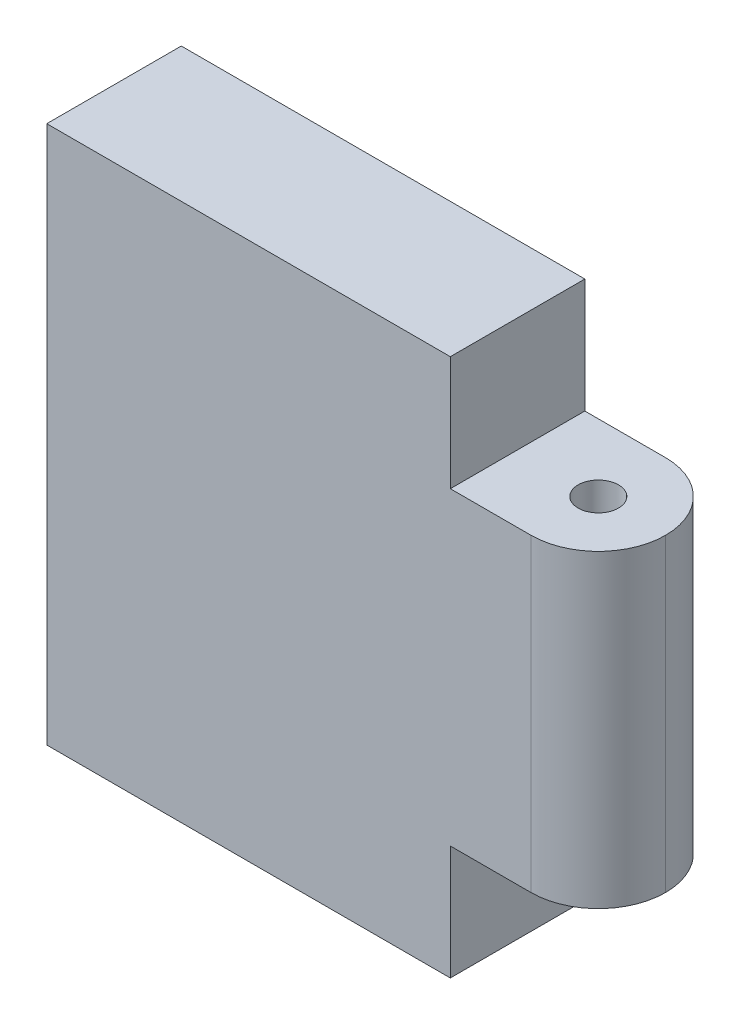
ISO-10303-21;
HEADER;
FILE_DESCRIPTION(('STEP AP214'),'2;1');
FILE_NAME('part.step','',(''),(''),'','','');
FILE_SCHEMA(('AUTOMOTIVE_DESIGN { 1 0 10303 214 1 1 1 1 }'));
ENDSEC;
DATA;
#1=APPLICATION_CONTEXT('core data for automotive mechanical design processes');
#2=APPLICATION_PROTOCOL_DEFINITION('international standard','automotive_design',2000,#1);
#3=PRODUCT_CONTEXT('',#1,'mechanical');
#4=PRODUCT('Part','Part','',(#3));
#5=PRODUCT_RELATED_PRODUCT_CATEGORY('part','',(#4));
#6=PRODUCT_DEFINITION_FORMATION('','',#4);
#7=PRODUCT_DEFINITION_CONTEXT('part definition',#1,'design');
#8=PRODUCT_DEFINITION('design','',#6,#7);
#9=PRODUCT_DEFINITION_SHAPE('','',#8);
#10=(LENGTH_UNIT() NAMED_UNIT(*) SI_UNIT(.MILLI.,.METRE.));
#11=(NAMED_UNIT(*) PLANE_ANGLE_UNIT() SI_UNIT($,.RADIAN.));
#12=(NAMED_UNIT(*) SI_UNIT($,.STERADIAN.) SOLID_ANGLE_UNIT());
#13=UNCERTAINTY_MEASURE_WITH_UNIT(LENGTH_MEASURE(1.E-05),#10,'distance_accuracy_value','');
#14=(GEOMETRIC_REPRESENTATION_CONTEXT(3) GLOBAL_UNCERTAINTY_ASSIGNED_CONTEXT((#13)) GLOBAL_UNIT_ASSIGNED_CONTEXT((#10,
#11,#12)) REPRESENTATION_CONTEXT('',''));
#15=CARTESIAN_POINT('',(0.,0.,0.));
#16=DIRECTION('',(0.,0.,1.));
#17=DIRECTION('',(1.,0.,0.));
#18=AXIS2_PLACEMENT_3D('',#15,#16,#17);
#19=CARTESIAN_POINT('',(0.,0.,0.));
#20=DIRECTION('',(-1.,0.,0.));
#21=DIRECTION('',(0.,-1.,0.));
#22=AXIS2_PLACEMENT_3D('',#19,#20,#21);
#23=PLANE('',#22);
#24=DIRECTION('',(0.,-1.,0.));
#25=VECTOR('',#24,1.);
#26=CARTESIAN_POINT('',(0.,0.,10.));
#27=LINE('',#26,#25);
#28=CARTESIAN_POINT('',(0.,20.,10.));
#29=VERTEX_POINT('',#28);
#30=CARTESIAN_POINT('',(0.,-20.,10.));
#31=VERTEX_POINT('',#30);
#32=EDGE_CURVE('E164',#29,#31,#27,.T.);
#33=ORIENTED_EDGE('',*,*,#32,.F.);
#34=DIRECTION('',(0.,0.,-1.));
#35=VECTOR('',#34,1.);
#36=CARTESIAN_POINT('',(0.,20.,10.));
#37=LINE('',#36,#35);
#38=CARTESIAN_POINT('',(0.,20.,0.));
#39=VERTEX_POINT('',#38);
#40=EDGE_CURVE('E130',#29,#39,#37,.T.);
#41=ORIENTED_EDGE('',*,*,#40,.T.);
#42=DIRECTION('',(0.,-1.,0.));
#43=VECTOR('',#42,1.);
#44=CARTESIAN_POINT('',(0.,0.,0.));
#45=LINE('',#44,#43);
#46=CARTESIAN_POINT('',(0.,-20.,0.));
#47=VERTEX_POINT('',#46);
#48=EDGE_CURVE('E117',#39,#47,#45,.T.);
#49=ORIENTED_EDGE('',*,*,#48,.T.);
#50=DIRECTION('',(0.,0.,1.));
#51=VECTOR('',#50,1.);
#52=CARTESIAN_POINT('',(0.,-20.,10.));
#53=LINE('',#52,#51);
#54=EDGE_CURVE('E126',#47,#31,#53,.T.);
#55=ORIENTED_EDGE('',*,*,#54,.T.);
#56=EDGE_LOOP('',(#33,#41,#49,#55));
#57=FACE_BOUND('',#56,.T.);
#58=ADVANCED_FACE('F38',(#57),#23,.T.);
#59=CARTESIAN_POINT('',(-30.,20.,10.));
#60=DIRECTION('',(0.,-1.,0.));
#61=DIRECTION('',(0.,0.,-1.));
#62=AXIS2_PLACEMENT_3D('',#59,#60,#61);
#63=PLANE('',#62);
#64=ORIENTED_EDGE('',*,*,#40,.F.);
#65=DIRECTION('',(-1.,0.,0.));
#66=VECTOR('',#65,1.);
#67=CARTESIAN_POINT('',(-30.,20.,10.));
#68=LINE('',#67,#66);
#69=CARTESIAN_POINT('',(30.,20.,10.));
#70=VERTEX_POINT('',#69);
#71=EDGE_CURVE('E138',#70,#29,#68,.T.);
#72=ORIENTED_EDGE('',*,*,#71,.F.);
#73=DIRECTION('',(0.,0.,-1.));
#74=VECTOR('',#73,1.);
#75=CARTESIAN_POINT('',(30.,20.,10.));
#76=LINE('',#75,#74);
#77=CARTESIAN_POINT('',(30.,20.,0.));
#78=VERTEX_POINT('',#77);
#79=EDGE_CURVE('E180',#70,#78,#76,.T.);
#80=ORIENTED_EDGE('',*,*,#79,.T.);
#81=DIRECTION('',(-1.,0.,0.));
#82=VECTOR('',#81,1.);
#83=CARTESIAN_POINT('',(-30.,20.,0.));
#84=LINE('',#83,#82);
#85=EDGE_CURVE('E42',#78,#39,#84,.T.);
#86=ORIENTED_EDGE('',*,*,#85,.T.);
#87=EDGE_LOOP('',(#64,#72,#80,#86));
#88=FACE_BOUND('',#87,.T.);
#89=ADVANCED_FACE('F204',(#88),#63,.F.);
#90=CARTESIAN_POINT('',(-30.,-20.,10.));
#91=DIRECTION('',(0.,1.,0.));
#92=DIRECTION('',(0.,0.,1.));
#93=AXIS2_PLACEMENT_3D('',#90,#91,#92);
#94=PLANE('',#93);
#95=ORIENTED_EDGE('',*,*,#54,.F.);
#96=DIRECTION('',(1.,0.,0.));
#97=VECTOR('',#96,1.);
#98=CARTESIAN_POINT('',(-30.,-20.,0.));
#99=LINE('',#98,#97);
#100=CARTESIAN_POINT('',(30.,-20.,0.));
#101=VERTEX_POINT('',#100);
#102=EDGE_CURVE('E112',#47,#101,#99,.T.);
#103=ORIENTED_EDGE('',*,*,#102,.T.);
#104=DIRECTION('',(0.,0.,-1.));
#105=VECTOR('',#104,1.);
#106=CARTESIAN_POINT('',(30.,-20.,10.));
#107=LINE('',#106,#105);
#108=CARTESIAN_POINT('',(30.,-20.,10.));
#109=VERTEX_POINT('',#108);
#110=EDGE_CURVE('E139',#109,#101,#107,.T.);
#111=ORIENTED_EDGE('',*,*,#110,.F.);
#112=DIRECTION('',(1.,0.,0.));
#113=VECTOR('',#112,1.);
#114=CARTESIAN_POINT('',(-30.,-20.,10.));
#115=LINE('',#114,#113);
#116=EDGE_CURVE('E128',#31,#109,#115,.T.);
#117=ORIENTED_EDGE('',*,*,#116,.F.);
#118=EDGE_LOOP('',(#95,#103,#111,#117));
#119=FACE_BOUND('',#118,.T.);
#120=ADVANCED_FACE('F127',(#119),#94,.F.);
#121=CARTESIAN_POINT('',(0.,0.,10.));
#122=DIRECTION('',(0.,0.,1.));
#123=DIRECTION('',(1.,0.,0.));
#124=AXIS2_PLACEMENT_3D('',#121,#122,#123);
#125=PLANE('',#124);
#126=ORIENTED_EDGE('',*,*,#71,.T.);
#127=ORIENTED_EDGE('',*,*,#32,.T.);
#128=ORIENTED_EDGE('',*,*,#116,.T.);
#129=DIRECTION('',(0.,1.,0.));
#130=VECTOR('',#129,1.);
#131=CARTESIAN_POINT('',(30.,20.,10.));
#132=LINE('',#131,#130);
#133=CARTESIAN_POINT('',(30.,-11.5,10.));
#134=VERTEX_POINT('',#133);
#135=EDGE_CURVE('E141',#109,#134,#132,.T.);
#136=ORIENTED_EDGE('',*,*,#135,.T.);
#137=DIRECTION('',(-1.,0.,0.));
#138=VECTOR('',#137,1.);
#139=CARTESIAN_POINT('',(41.,-11.5,10.));
#140=LINE('',#139,#138);
#141=CARTESIAN_POINT('',(36.,-11.5,10.));
#142=VERTEX_POINT('',#141);
#143=EDGE_CURVE('E63',#142,#134,#140,.T.);
#144=ORIENTED_EDGE('',*,*,#143,.F.);
#145=DIRECTION('',(0.,1.,0.));
#146=VECTOR('',#145,1.);
#147=CARTESIAN_POINT('',(36.,0.,10.));
#148=LINE('',#147,#146);
#149=CARTESIAN_POINT('',(36.,11.5,10.));
#150=VERTEX_POINT('',#149);
#151=EDGE_CURVE('E165',#142,#150,#148,.T.);
#152=ORIENTED_EDGE('',*,*,#151,.T.);
#153=DIRECTION('',(-1.,0.,0.));
#154=VECTOR('',#153,1.);
#155=CARTESIAN_POINT('',(41.,11.5,10.));
#156=LINE('',#155,#154);
#157=CARTESIAN_POINT('',(30.,11.5,10.));
#158=VERTEX_POINT('',#157);
#159=EDGE_CURVE('E55',#150,#158,#156,.T.);
#160=ORIENTED_EDGE('',*,*,#159,.T.);
#161=EDGE_CURVE('E123',#158,#70,#132,.T.);
#162=ORIENTED_EDGE('',*,*,#161,.T.);
#163=EDGE_LOOP('',(#126,#127,#128,#136,#144,#152,#160,#162));
#164=FACE_BOUND('',#163,.T.);
#165=ADVANCED_FACE('F40',(#164),#125,.T.);
#166=CARTESIAN_POINT('',(0.,0.,0.));
#167=DIRECTION('',(0.,0.,1.));
#168=DIRECTION('',(1.,0.,0.));
#169=AXIS2_PLACEMENT_3D('',#166,#167,#168);
#170=PLANE('',#169);
#171=ORIENTED_EDGE('',*,*,#48,.F.);
#172=ORIENTED_EDGE('',*,*,#85,.F.);
#173=DIRECTION('',(0.,1.,0.));
#174=VECTOR('',#173,1.);
#175=CARTESIAN_POINT('',(30.,20.,0.));
#176=LINE('',#175,#174);
#177=CARTESIAN_POINT('',(30.,11.5,0.));
#178=VERTEX_POINT('',#177);
#179=EDGE_CURVE('E151',#178,#78,#176,.T.);
#180=ORIENTED_EDGE('',*,*,#179,.F.);
#181=DIRECTION('',(-1.,0.,0.));
#182=VECTOR('',#181,1.);
#183=CARTESIAN_POINT('',(41.,11.5,0.));
#184=LINE('',#183,#182);
#185=CARTESIAN_POINT('',(36.,11.5,0.));
#186=VERTEX_POINT('',#185);
#187=EDGE_CURVE('E149',#186,#178,#184,.T.);
#188=ORIENTED_EDGE('',*,*,#187,.F.);
#189=DIRECTION('',(0.,-1.,0.));
#190=VECTOR('',#189,1.);
#191=CARTESIAN_POINT('',(36.,-11.5,0.));
#192=LINE('',#191,#190);
#193=CARTESIAN_POINT('',(36.,-11.5,0.));
#194=VERTEX_POINT('',#193);
#195=EDGE_CURVE('E177',#186,#194,#192,.T.);
#196=ORIENTED_EDGE('',*,*,#195,.T.);
#197=DIRECTION('',(-1.,0.,0.));
#198=VECTOR('',#197,1.);
#199=CARTESIAN_POINT('',(41.,-11.5,0.));
#200=LINE('',#199,#198);
#201=CARTESIAN_POINT('',(30.,-11.5,0.));
#202=VERTEX_POINT('',#201);
#203=EDGE_CURVE('E154',#194,#202,#200,.T.);
#204=ORIENTED_EDGE('',*,*,#203,.T.);
#205=EDGE_CURVE('E119',#101,#202,#176,.T.);
#206=ORIENTED_EDGE('',*,*,#205,.F.);
#207=ORIENTED_EDGE('',*,*,#102,.F.);
#208=EDGE_LOOP('',(#171,#172,#180,#188,#196,#204,#206,#207));
#209=FACE_BOUND('',#208,.T.);
#210=ADVANCED_FACE('F114',(#209),#170,.F.);
#211=CARTESIAN_POINT('',(30.,20.,10.));
#212=DIRECTION('',(-1.,0.,0.));
#213=DIRECTION('',(0.,-1.,0.));
#214=AXIS2_PLACEMENT_3D('',#211,#212,#213);
#215=PLANE('',#214);
#216=ORIENTED_EDGE('',*,*,#205,.T.);
#217=DIRECTION('',(0.,0.,1.));
#218=VECTOR('',#217,1.);
#219=CARTESIAN_POINT('',(30.,-11.5,0.));
#220=LINE('',#219,#218);
#221=EDGE_CURVE('E156',#202,#134,#220,.T.);
#222=ORIENTED_EDGE('',*,*,#221,.T.);
#223=ORIENTED_EDGE('',*,*,#135,.F.);
#224=ORIENTED_EDGE('',*,*,#110,.T.);
#225=EDGE_LOOP('',(#216,#222,#223,#224));
#226=FACE_BOUND('',#225,.T.);
#227=ADVANCED_FACE('F185',(#226),#215,.F.);
#228=ORIENTED_EDGE('',*,*,#161,.F.);
#229=DIRECTION('',(0.,0.,-1.));
#230=VECTOR('',#229,1.);
#231=CARTESIAN_POINT('',(30.,11.5,0.));
#232=LINE('',#231,#230);
#233=EDGE_CURVE('E158',#158,#178,#232,.T.);
#234=ORIENTED_EDGE('',*,*,#233,.T.);
#235=ORIENTED_EDGE('',*,*,#179,.T.);
#236=ORIENTED_EDGE('',*,*,#79,.F.);
#237=EDGE_LOOP('',(#228,#234,#235,#236));
#238=FACE_BOUND('',#237,.T.);
#239=ADVANCED_FACE('F224',(#238),#215,.F.);
#240=CARTESIAN_POINT('',(41.,11.5,0.));
#241=DIRECTION('',(0.,1.,0.));
#242=DIRECTION('',(-1.,0.,0.));
#243=AXIS2_PLACEMENT_3D('',#240,#241,#242);
#244=PLANE('',#243);
#245=CARTESIAN_POINT('',(36.,11.5,5.));
#246=DIRECTION('',(0.,-1.,0.));
#247=DIRECTION('',(1.,0.,0.));
#248=AXIS2_PLACEMENT_3D('',#245,#246,#247);
#249=CIRCLE('',#248,1.5);
#250=CARTESIAN_POINT('',(37.5,11.5,5.));
#251=VERTEX_POINT('',#250);
#252=EDGE_CURVE('E47',#251,#251,#249,.T.);
#253=ORIENTED_EDGE('',*,*,#252,.T.);
#254=EDGE_LOOP('',(#253));
#255=FACE_BOUND('',#254,.T.);
#256=CARTESIAN_POINT('',(36.,11.5,5.));
#257=DIRECTION('',(0.,1.,0.));
#258=DIRECTION('',(-1.,0.,0.));
#259=AXIS2_PLACEMENT_3D('',#256,#257,#258);
#260=CIRCLE('',#259,5.);
#261=CARTESIAN_POINT('',(41.,11.5,5.));
#262=VERTEX_POINT('',#261);
#263=EDGE_CURVE('E169',#150,#262,#260,.T.);
#264=ORIENTED_EDGE('',*,*,#263,.T.);
#265=CARTESIAN_POINT('',(36.,11.5,5.));
#266=DIRECTION('',(0.,1.,0.));
#267=DIRECTION('',(-1.,0.,0.));
#268=AXIS2_PLACEMENT_3D('',#265,#266,#267);
#269=CIRCLE('',#268,5.);
#270=EDGE_CURVE('E166',#262,#186,#269,.T.);
#271=ORIENTED_EDGE('',*,*,#270,.T.);
#272=ORIENTED_EDGE('',*,*,#187,.T.);
#273=ORIENTED_EDGE('',*,*,#233,.F.);
#274=ORIENTED_EDGE('',*,*,#159,.F.);
#275=EDGE_LOOP('',(#264,#271,#272,#273,#274));
#276=FACE_BOUND('',#275,.T.);
#277=ADVANCED_FACE('F220',(#255,#276),#244,.T.);
#278=CARTESIAN_POINT('',(41.,-11.5,0.));
#279=DIRECTION('',(0.,-1.,0.));
#280=DIRECTION('',(1.,0.,0.));
#281=AXIS2_PLACEMENT_3D('',#278,#279,#280);
#282=PLANE('',#281);
#283=CARTESIAN_POINT('',(36.,-11.5,5.));
#284=DIRECTION('',(0.,-1.,0.));
#285=DIRECTION('',(1.,0.,0.));
#286=AXIS2_PLACEMENT_3D('',#283,#284,#285);
#287=CIRCLE('',#286,1.5);
#288=CARTESIAN_POINT('',(37.5,-11.5,5.));
#289=VERTEX_POINT('',#288);
#290=EDGE_CURVE('E161',#289,#289,#287,.F.);
#291=ORIENTED_EDGE('',*,*,#290,.T.);
#292=EDGE_LOOP('',(#291));
#293=FACE_BOUND('',#292,.T.);
#294=ORIENTED_EDGE('',*,*,#203,.F.);
#295=CARTESIAN_POINT('',(36.,-11.5,5.));
#296=DIRECTION('',(0.,-1.,0.));
#297=DIRECTION('',(1.,0.,0.));
#298=AXIS2_PLACEMENT_3D('',#295,#296,#297);
#299=CIRCLE('',#298,5.);
#300=CARTESIAN_POINT('',(41.,-11.5,5.));
#301=VERTEX_POINT('',#300);
#302=EDGE_CURVE('E173',#194,#301,#299,.T.);
#303=ORIENTED_EDGE('',*,*,#302,.T.);
#304=CARTESIAN_POINT('',(36.,-11.5,5.));
#305=DIRECTION('',(0.,-1.,0.));
#306=DIRECTION('',(1.,0.,0.));
#307=AXIS2_PLACEMENT_3D('',#304,#305,#306);
#308=CIRCLE('',#307,5.);
#309=EDGE_CURVE('E175',#301,#142,#308,.T.);
#310=ORIENTED_EDGE('',*,*,#309,.T.);
#311=ORIENTED_EDGE('',*,*,#143,.T.);
#312=ORIENTED_EDGE('',*,*,#221,.F.);
#313=EDGE_LOOP('',(#294,#303,#310,#311,#312));
#314=FACE_BOUND('',#313,.T.);
#315=ADVANCED_FACE('F187',(#293,#314),#282,.T.);
#316=CARTESIAN_POINT('',(36.,-18.5,5.));
#317=DIRECTION('',(0.,1.,0.));
#318=DIRECTION('',(-1.,0.,0.));
#319=AXIS2_PLACEMENT_3D('',#316,#317,#318);
#320=CYLINDRICAL_SURFACE('',#319,1.5);
#321=ORIENTED_EDGE('',*,*,#290,.F.);
#322=EDGE_LOOP('',(#321));
#323=FACE_BOUND('',#322,.T.);
#324=ORIENTED_EDGE('',*,*,#252,.F.);
#325=EDGE_LOOP('',(#324));
#326=FACE_BOUND('',#325,.T.);
#327=ADVANCED_FACE('F214',(#323,#326),#320,.F.);
#328=CARTESIAN_POINT('',(36.,0.,5.));
#329=DIRECTION('',(0.,1.,0.));
#330=DIRECTION('',(-1.,0.,0.));
#331=AXIS2_PLACEMENT_3D('',#328,#329,#330);
#332=CYLINDRICAL_SURFACE('',#331,5.);
#333=DIRECTION('',(0.,1.,0.));
#334=VECTOR('',#333,1.);
#335=CARTESIAN_POINT('',(41.,0.,5.));
#336=LINE('',#335,#334);
#337=EDGE_CURVE('E11',#262,#301,#336,.F.);
#338=ORIENTED_EDGE('',*,*,#337,.F.);
#339=ORIENTED_EDGE('',*,*,#263,.F.);
#340=ORIENTED_EDGE('',*,*,#151,.F.);
#341=ORIENTED_EDGE('',*,*,#309,.F.);
#342=EDGE_LOOP('',(#338,#339,#340,#341));
#343=FACE_BOUND('',#342,.T.);
#344=ADVANCED_FACE('F198',(#343),#332,.T.);
#345=CARTESIAN_POINT('',(36.,0.,5.));
#346=DIRECTION('',(0.,1.,0.));
#347=DIRECTION('',(-1.,0.,0.));
#348=AXIS2_PLACEMENT_3D('',#345,#346,#347);
#349=CYLINDRICAL_SURFACE('',#348,5.);
#350=ORIENTED_EDGE('',*,*,#270,.F.);
#351=ORIENTED_EDGE('',*,*,#337,.T.);
#352=ORIENTED_EDGE('',*,*,#302,.F.);
#353=ORIENTED_EDGE('',*,*,#195,.F.);
#354=EDGE_LOOP('',(#350,#351,#352,#353));
#355=FACE_BOUND('',#354,.T.);
#356=ADVANCED_FACE('F194',(#355),#349,.T.);
#357=CLOSED_SHELL('',(#58,#89,#120,#165,#210,#227,#239,#277,#315,#327,#344,#356));
#358=MANIFOLD_SOLID_BREP('B2',#357);
#359=ADVANCED_BREP_SHAPE_REPRESENTATION('',(#18,#358),#14);
#360=SHAPE_DEFINITION_REPRESENTATION(#9,#359);
ENDSEC;
END-ISO-10303-21;
